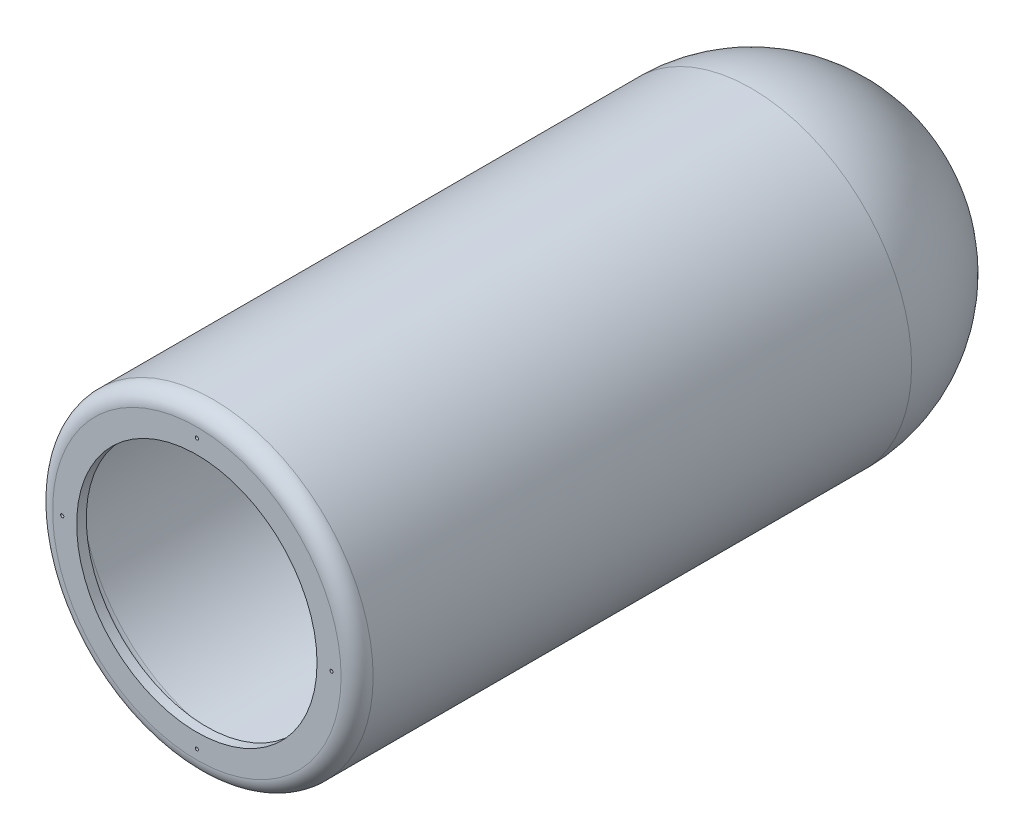
ISO-10303-21;
HEADER;
FILE_DESCRIPTION(('STEP AP214'),'2;1');
FILE_NAME('part.step','',(''),(''),'','','');
FILE_SCHEMA(('AUTOMOTIVE_DESIGN { 1 0 10303 214 1 1 1 1 }'));
ENDSEC;
DATA;
#1=APPLICATION_CONTEXT('core data for automotive mechanical design processes');
#2=APPLICATION_PROTOCOL_DEFINITION('international standard','automotive_design',2000,#1);
#3=PRODUCT_CONTEXT('',#1,'mechanical');
#4=PRODUCT('Part','Part','',(#3));
#5=PRODUCT_RELATED_PRODUCT_CATEGORY('part','',(#4));
#6=PRODUCT_DEFINITION_FORMATION('','',#4);
#7=PRODUCT_DEFINITION_CONTEXT('part definition',#1,'design');
#8=PRODUCT_DEFINITION('design','',#6,#7);
#9=PRODUCT_DEFINITION_SHAPE('','',#8);
#10=(LENGTH_UNIT() NAMED_UNIT(*) SI_UNIT(.MILLI.,.METRE.));
#11=(NAMED_UNIT(*) PLANE_ANGLE_UNIT() SI_UNIT($,.RADIAN.));
#12=(NAMED_UNIT(*) SI_UNIT($,.STERADIAN.) SOLID_ANGLE_UNIT());
#13=UNCERTAINTY_MEASURE_WITH_UNIT(LENGTH_MEASURE(1.E-05),#10,'distance_accuracy_value','');
#14=(GEOMETRIC_REPRESENTATION_CONTEXT(3) GLOBAL_UNCERTAINTY_ASSIGNED_CONTEXT((#13)) GLOBAL_UNIT_ASSIGNED_CONTEXT((#10,
#11,#12)) REPRESENTATION_CONTEXT('',''));
#15=CARTESIAN_POINT('',(0.,0.,0.));
#16=DIRECTION('',(0.,0.,1.));
#17=DIRECTION('',(1.,0.,0.));
#18=AXIS2_PLACEMENT_3D('',#15,#16,#17);
#19=CARTESIAN_POINT('',(0.,0.,0.));
#20=DIRECTION('',(0.,0.,1.));
#21=DIRECTION('',(1.,0.,0.));
#22=AXIS2_PLACEMENT_3D('',#19,#20,#21);
#23=PLANE('',#22);
#24=CARTESIAN_POINT('',(0.,0.,0.));
#25=DIRECTION('',(0.,0.,1.));
#26=DIRECTION('',(1.,0.,0.));
#27=AXIS2_PLACEMENT_3D('',#24,#25,#26);
#28=CIRCLE('',#27,39.);
#29=CARTESIAN_POINT('',(39.,0.,0.));
#30=VERTEX_POINT('',#29);
#31=EDGE_CURVE('E48',#30,#30,#28,.F.);
#32=ORIENTED_EDGE('',*,*,#31,.T.);
#33=EDGE_LOOP('',(#32));
#34=FACE_BOUND('',#33,.T.);
#35=CARTESIAN_POINT('',(0.,0.,0.));
#36=DIRECTION('',(0.,0.,1.));
#37=DIRECTION('',(1.,0.,0.));
#38=AXIS2_PLACEMENT_3D('',#35,#36,#37);
#39=CIRCLE('',#38,37.5);
#40=CARTESIAN_POINT('',(37.5,0.,0.));
#41=VERTEX_POINT('',#40);
#42=EDGE_CURVE('E57',#41,#41,#39,.T.);
#43=ORIENTED_EDGE('',*,*,#42,.T.);
#44=EDGE_LOOP('',(#43));
#45=FACE_BOUND('',#44,.T.);
#46=ADVANCED_FACE('F33',(#34,#45),#23,.F.);
#47=CARTESIAN_POINT('',(0.,0.,3.));
#48=DIRECTION('',(0.,0.,-1.));
#49=DIRECTION('',(-1.,0.,0.));
#50=AXIS2_PLACEMENT_3D('',#47,#48,#49);
#51=CYLINDRICAL_SURFACE('',#50,50.);
#52=CARTESIAN_POINT('',(0.,0.,-2.));
#53=DIRECTION('',(0.,0.,1.));
#54=DIRECTION('',(1.,0.,0.));
#55=AXIS2_PLACEMENT_3D('',#52,#53,#54);
#56=CIRCLE('',#55,50.);
#57=CARTESIAN_POINT('',(50.,0.,-2.));
#58=VERTEX_POINT('',#57);
#59=EDGE_CURVE('E10',#58,#58,#56,.F.);
#60=ORIENTED_EDGE('',*,*,#59,.T.);
#61=EDGE_LOOP('',(#60));
#62=FACE_BOUND('',#61,.T.);
#63=CARTESIAN_POINT('',(0.,0.,-170.));
#64=DIRECTION('',(0.,0.,-1.));
#65=DIRECTION('',(-1.,0.,0.));
#66=AXIS2_PLACEMENT_3D('',#63,#64,#65);
#67=CIRCLE('',#66,50.);
#68=CARTESIAN_POINT('',(-50.,0.,-170.));
#69=VERTEX_POINT('',#68);
#70=EDGE_CURVE('E63',#69,#69,#67,.T.);
#71=ORIENTED_EDGE('',*,*,#70,.F.);
#72=EDGE_LOOP('',(#71));
#73=FACE_BOUND('',#72,.T.);
#74=ADVANCED_FACE('F114',(#62,#73),#51,.T.);
#75=CARTESIAN_POINT('',(0.,0.,3.));
#76=DIRECTION('',(0.,0.,1.));
#77=DIRECTION('',(1.,0.,0.));
#78=AXIS2_PLACEMENT_3D('',#75,#76,#77);
#79=PLANE('',#78);
#80=CARTESIAN_POINT('',(0.,0.,3.));
#81=DIRECTION('',(0.,0.,1.));
#82=DIRECTION('',(1.,0.,0.));
#83=AXIS2_PLACEMENT_3D('',#80,#81,#82);
#84=CIRCLE('',#83,45.);
#85=CARTESIAN_POINT('',(45.,0.,3.));
#86=VERTEX_POINT('',#85);
#87=EDGE_CURVE('E40',#86,#86,#84,.T.);
#88=ORIENTED_EDGE('',*,*,#87,.T.);
#89=EDGE_LOOP('',(#88));
#90=FACE_BOUND('',#89,.T.);
#91=CARTESIAN_POINT('',(-42.,1.46642216231412E-13,3.));
#92=DIRECTION('',(0.,0.,1.));
#93=DIRECTION('',(1.,0.,0.));
#94=AXIS2_PLACEMENT_3D('',#91,#92,#93);
#95=CIRCLE('',#94,0.499999999999999);
#96=CARTESIAN_POINT('',(-41.5,1.46642216231412E-13,3.));
#97=VERTEX_POINT('',#96);
#98=EDGE_CURVE('E88',#97,#97,#95,.T.);
#99=ORIENTED_EDGE('',*,*,#98,.F.);
#100=EDGE_LOOP('',(#99));
#101=FACE_BOUND('',#100,.T.);
#102=CARTESIAN_POINT('',(2.93284432462823E-13,42.,3.));
#103=DIRECTION('',(0.,0.,1.));
#104=DIRECTION('',(1.,0.,0.));
#105=AXIS2_PLACEMENT_3D('',#102,#103,#104);
#106=CIRCLE('',#105,0.5);
#107=CARTESIAN_POINT('',(0.500000000000293,42.,3.));
#108=VERTEX_POINT('',#107);
#109=EDGE_CURVE('E82',#108,#108,#106,.T.);
#110=ORIENTED_EDGE('',*,*,#109,.F.);
#111=EDGE_LOOP('',(#110));
#112=FACE_BOUND('',#111,.T.);
#113=CARTESIAN_POINT('',(42.,-4.39926648694235E-13,3.));
#114=DIRECTION('',(0.,0.,1.));
#115=DIRECTION('',(1.,0.,0.));
#116=AXIS2_PLACEMENT_3D('',#113,#114,#115);
#117=CIRCLE('',#116,0.499999999999999);
#118=CARTESIAN_POINT('',(42.5,-4.39926648694235E-13,3.));
#119=VERTEX_POINT('',#118);
#120=EDGE_CURVE('E76',#119,#119,#117,.T.);
#121=ORIENTED_EDGE('',*,*,#120,.F.);
#122=EDGE_LOOP('',(#121));
#123=FACE_BOUND('',#122,.T.);
#124=CARTESIAN_POINT('',(0.,-42.,3.));
#125=DIRECTION('',(0.,0.,1.));
#126=DIRECTION('',(1.,0.,0.));
#127=AXIS2_PLACEMENT_3D('',#124,#125,#126);
#128=CIRCLE('',#127,0.5);
#129=CARTESIAN_POINT('',(0.5,-42.,3.));
#130=VERTEX_POINT('',#129);
#131=EDGE_CURVE('E70',#130,#130,#128,.T.);
#132=ORIENTED_EDGE('',*,*,#131,.F.);
#133=EDGE_LOOP('',(#132));
#134=FACE_BOUND('',#133,.T.);
#135=CARTESIAN_POINT('',(0.,0.,3.));
#136=DIRECTION('',(0.,0.,1.));
#137=DIRECTION('',(1.,0.,0.));
#138=AXIS2_PLACEMENT_3D('',#135,#136,#137);
#139=CIRCLE('',#138,37.5);
#140=CARTESIAN_POINT('',(37.5,0.,3.));
#141=VERTEX_POINT('',#140);
#142=EDGE_CURVE('E60',#141,#141,#139,.T.);
#143=ORIENTED_EDGE('',*,*,#142,.F.);
#144=EDGE_LOOP('',(#143));
#145=FACE_BOUND('',#144,.T.);
#146=ADVANCED_FACE('F120',(#90,#101,#112,#123,#134,#145),#79,.T.);
#147=CARTESIAN_POINT('',(0.,0.,-1.));
#148=DIRECTION('',(0.,0.,1.));
#149=DIRECTION('',(1.,0.,0.));
#150=AXIS2_PLACEMENT_3D('',#147,#148,#149);
#151=CYLINDRICAL_SURFACE('',#150,37.5);
#152=ORIENTED_EDGE('',*,*,#142,.T.);
#153=EDGE_LOOP('',(#152));
#154=FACE_BOUND('',#153,.T.);
#155=ORIENTED_EDGE('',*,*,#42,.F.);
#156=EDGE_LOOP('',(#155));
#157=FACE_BOUND('',#156,.T.);
#158=ADVANCED_FACE('F135',(#154,#157),#151,.F.);
#159=CARTESIAN_POINT('',(0.,0.,-170.));
#160=DIRECTION('',(0.,0.,1.));
#161=DIRECTION('',(1.,0.,0.));
#162=AXIS2_PLACEMENT_3D('',#159,#160,#161);
#163=CYLINDRICAL_SURFACE('',#162,47.);
#164=CARTESIAN_POINT('',(0.,0.,-8.00000000000001));
#165=DIRECTION('',(0.,0.,1.));
#166=DIRECTION('',(1.,0.,0.));
#167=AXIS2_PLACEMENT_3D('',#164,#165,#166);
#168=CIRCLE('',#167,47.);
#169=CARTESIAN_POINT('',(47.,0.,-8.00000000000001));
#170=VERTEX_POINT('',#169);
#171=EDGE_CURVE('E44',#170,#170,#168,.T.);
#172=ORIENTED_EDGE('',*,*,#171,.T.);
#173=EDGE_LOOP('',(#172));
#174=FACE_BOUND('',#173,.T.);
#175=CARTESIAN_POINT('',(0.,0.,-170.));
#176=DIRECTION('',(0.,0.,-1.));
#177=DIRECTION('',(-1.,0.,0.));
#178=AXIS2_PLACEMENT_3D('',#175,#176,#177);
#179=CIRCLE('',#178,47.);
#180=CARTESIAN_POINT('',(-47.,0.,-170.));
#181=VERTEX_POINT('',#180);
#182=EDGE_CURVE('E66',#181,#181,#179,.T.);
#183=ORIENTED_EDGE('',*,*,#182,.T.);
#184=EDGE_LOOP('',(#183));
#185=FACE_BOUND('',#184,.T.);
#186=ADVANCED_FACE('F127',(#174,#185),#163,.F.);
#187=CARTESIAN_POINT('',(0.,0.,-8.00000000000001));
#188=DIRECTION('',(0.,0.,1.));
#189=DIRECTION('',(1.,0.,0.));
#190=AXIS2_PLACEMENT_3D('',#187,#188,#189);
#191=TOROIDAL_SURFACE('',#190,39.,8.);
#192=ORIENTED_EDGE('',*,*,#171,.F.);
#193=EDGE_LOOP('',(#192));
#194=FACE_BOUND('',#193,.T.);
#195=ORIENTED_EDGE('',*,*,#31,.F.);
#196=EDGE_LOOP('',(#195));
#197=FACE_BOUND('',#196,.T.);
#198=ADVANCED_FACE('F125',(#194,#197),#191,.F.);
#199=CARTESIAN_POINT('',(0.,0.,-170.));
#200=DIRECTION('',(1.,0.,0.));
#201=DIRECTION('',(0.,-1.,0.));
#202=AXIS2_PLACEMENT_3D('',#199,#200,#201);
#203=SPHERICAL_SURFACE('',#202,47.);
#204=CARTESIAN_POINT('',(0.,0.,-170.));
#205=DIRECTION('',(0.,0.,1.));
#206=DIRECTION('',(1.,0.,0.));
#207=AXIS2_PLACEMENT_3D('',#204,#205,#206);
#208=SPHERICAL_SURFACE('',#207,47.);
#209=CARTESIAN_POINT('',(0.,0.,-216.976057731572));
#210=DIRECTION('',(0.,0.,1.));
#211=DIRECTION('',(1.,0.,0.));
#212=AXIS2_PLACEMENT_3D('',#209,#210,#211);
#213=CIRCLE('',#212,1.5);
#214=CARTESIAN_POINT('',(1.5,0.,-216.976057731572));
#215=VERTEX_POINT('',#214);
#216=EDGE_CURVE('E53',#215,#215,#213,.F.);
#217=ORIENTED_EDGE('',*,*,#216,.T.);
#218=EDGE_LOOP('',(#217));
#219=FACE_BOUND('',#218,.T.);
#220=ORIENTED_EDGE('',*,*,#182,.F.);
#221=EDGE_LOOP('',(#220));
#222=FACE_BOUND('',#221,.T.);
#223=ADVANCED_FACE('F96',(#219,#222),#208,.F.);
#224=CARTESIAN_POINT('',(0.,0.,-170.));
#225=DIRECTION('',(1.,0.,0.));
#226=DIRECTION('',(0.,-1.,0.));
#227=AXIS2_PLACEMENT_3D('',#224,#225,#226);
#228=SPHERICAL_SURFACE('',#227,50.);
#229=CARTESIAN_POINT('',(0.,0.,-170.));
#230=DIRECTION('',(0.,0.,1.));
#231=DIRECTION('',(1.,0.,0.));
#232=AXIS2_PLACEMENT_3D('',#229,#230,#231);
#233=SPHERICAL_SURFACE('',#232,50.);
#234=CARTESIAN_POINT('',(0.,0.,-219.977494935221));
#235=DIRECTION('',(0.,0.,1.));
#236=DIRECTION('',(1.,0.,0.));
#237=AXIS2_PLACEMENT_3D('',#234,#235,#236);
#238=CIRCLE('',#237,1.5);
#239=CARTESIAN_POINT('',(1.5,0.,-219.977494935221));
#240=VERTEX_POINT('',#239);
#241=EDGE_CURVE('E51',#240,#240,#238,.T.);
#242=ORIENTED_EDGE('',*,*,#241,.T.);
#243=EDGE_LOOP('',(#242));
#244=FACE_BOUND('',#243,.T.);
#245=ORIENTED_EDGE('',*,*,#70,.T.);
#246=EDGE_LOOP('',(#245));
#247=FACE_BOUND('',#246,.T.);
#248=ADVANCED_FACE('F133',(#244,#247),#233,.T.);
#249=CARTESIAN_POINT('',(0.,-42.,0.));
#250=DIRECTION('',(0.,0.,1.));
#251=DIRECTION('',(1.,0.,0.));
#252=AXIS2_PLACEMENT_3D('',#249,#250,#251);
#253=CYLINDRICAL_SURFACE('',#252,0.5);
#254=CARTESIAN_POINT('',(0.,-42.,0.));
#255=DIRECTION('',(0.,0.,1.));
#256=DIRECTION('',(1.,0.,0.));
#257=AXIS2_PLACEMENT_3D('',#254,#255,#256);
#258=CIRCLE('',#257,0.5);
#259=CARTESIAN_POINT('',(0.5,-42.,0.));
#260=VERTEX_POINT('',#259);
#261=EDGE_CURVE('E69',#260,#260,#258,.T.);
#262=ORIENTED_EDGE('',*,*,#261,.F.);
#263=EDGE_LOOP('',(#262));
#264=FACE_BOUND('',#263,.T.);
#265=ORIENTED_EDGE('',*,*,#131,.T.);
#266=EDGE_LOOP('',(#265));
#267=FACE_BOUND('',#266,.T.);
#268=ADVANCED_FACE('F150',(#264,#267),#253,.F.);
#269=CARTESIAN_POINT('',(0.,-42.,0.));
#270=DIRECTION('',(0.,0.,1.));
#271=DIRECTION('',(1.,0.,0.));
#272=AXIS2_PLACEMENT_3D('',#269,#270,#271);
#273=PLANE('',#272);
#274=ORIENTED_EDGE('',*,*,#261,.T.);
#275=EDGE_LOOP('',(#274));
#276=FACE_BOUND('',#275,.T.);
#277=ADVANCED_FACE('F154',(#276),#273,.T.);
#278=CARTESIAN_POINT('',(42.,-4.39926648694235E-13,0.));
#279=DIRECTION('',(0.,0.,1.));
#280=DIRECTION('',(1.,0.,0.));
#281=AXIS2_PLACEMENT_3D('',#278,#279,#280);
#282=CYLINDRICAL_SURFACE('',#281,0.499999999999999);
#283=CARTESIAN_POINT('',(42.,-4.39926648694235E-13,0.));
#284=DIRECTION('',(0.,0.,1.));
#285=DIRECTION('',(1.,0.,0.));
#286=AXIS2_PLACEMENT_3D('',#283,#284,#285);
#287=CIRCLE('',#286,0.499999999999999);
#288=CARTESIAN_POINT('',(42.5,-4.39926648694235E-13,0.));
#289=VERTEX_POINT('',#288);
#290=EDGE_CURVE('E79',#289,#289,#287,.T.);
#291=ORIENTED_EDGE('',*,*,#290,.F.);
#292=EDGE_LOOP('',(#291));
#293=FACE_BOUND('',#292,.T.);
#294=ORIENTED_EDGE('',*,*,#120,.T.);
#295=EDGE_LOOP('',(#294));
#296=FACE_BOUND('',#295,.T.);
#297=ADVANCED_FACE('F158',(#293,#296),#282,.F.);
#298=CARTESIAN_POINT('',(42.,-4.39926648694235E-13,0.));
#299=DIRECTION('',(0.,0.,1.));
#300=DIRECTION('',(1.,0.,0.));
#301=AXIS2_PLACEMENT_3D('',#298,#299,#300);
#302=PLANE('',#301);
#303=ORIENTED_EDGE('',*,*,#290,.T.);
#304=EDGE_LOOP('',(#303));
#305=FACE_BOUND('',#304,.T.);
#306=ADVANCED_FACE('F162',(#305),#302,.T.);
#307=CARTESIAN_POINT('',(2.93284432462823E-13,42.,0.));
#308=DIRECTION('',(0.,0.,1.));
#309=DIRECTION('',(1.,0.,0.));
#310=AXIS2_PLACEMENT_3D('',#307,#308,#309);
#311=CYLINDRICAL_SURFACE('',#310,0.5);
#312=CARTESIAN_POINT('',(2.93284432462823E-13,42.,0.));
#313=DIRECTION('',(0.,0.,1.));
#314=DIRECTION('',(1.,0.,0.));
#315=AXIS2_PLACEMENT_3D('',#312,#313,#314);
#316=CIRCLE('',#315,0.5);
#317=CARTESIAN_POINT('',(0.500000000000293,42.,0.));
#318=VERTEX_POINT('',#317);
#319=EDGE_CURVE('E85',#318,#318,#316,.T.);
#320=ORIENTED_EDGE('',*,*,#319,.F.);
#321=EDGE_LOOP('',(#320));
#322=FACE_BOUND('',#321,.T.);
#323=ORIENTED_EDGE('',*,*,#109,.T.);
#324=EDGE_LOOP('',(#323));
#325=FACE_BOUND('',#324,.T.);
#326=ADVANCED_FACE('F166',(#322,#325),#311,.F.);
#327=CARTESIAN_POINT('',(2.93284432462823E-13,42.,0.));
#328=DIRECTION('',(0.,0.,1.));
#329=DIRECTION('',(1.,0.,0.));
#330=AXIS2_PLACEMENT_3D('',#327,#328,#329);
#331=PLANE('',#330);
#332=ORIENTED_EDGE('',*,*,#319,.T.);
#333=EDGE_LOOP('',(#332));
#334=FACE_BOUND('',#333,.T.);
#335=ADVANCED_FACE('F170',(#334),#331,.T.);
#336=CARTESIAN_POINT('',(-42.,1.46642216231412E-13,0.));
#337=DIRECTION('',(0.,0.,1.));
#338=DIRECTION('',(1.,0.,0.));
#339=AXIS2_PLACEMENT_3D('',#336,#337,#338);
#340=CYLINDRICAL_SURFACE('',#339,0.499999999999999);
#341=CARTESIAN_POINT('',(-42.,1.46642216231412E-13,0.));
#342=DIRECTION('',(0.,0.,1.));
#343=DIRECTION('',(1.,0.,0.));
#344=AXIS2_PLACEMENT_3D('',#341,#342,#343);
#345=CIRCLE('',#344,0.499999999999999);
#346=CARTESIAN_POINT('',(-41.5,1.46642216231412E-13,0.));
#347=VERTEX_POINT('',#346);
#348=EDGE_CURVE('E73',#347,#347,#345,.T.);
#349=ORIENTED_EDGE('',*,*,#348,.F.);
#350=EDGE_LOOP('',(#349));
#351=FACE_BOUND('',#350,.T.);
#352=ORIENTED_EDGE('',*,*,#98,.T.);
#353=EDGE_LOOP('',(#352));
#354=FACE_BOUND('',#353,.T.);
#355=ADVANCED_FACE('F109',(#351,#354),#340,.F.);
#356=CARTESIAN_POINT('',(-42.,1.46642216231412E-13,0.));
#357=DIRECTION('',(0.,0.,1.));
#358=DIRECTION('',(1.,0.,0.));
#359=AXIS2_PLACEMENT_3D('',#356,#357,#358);
#360=PLANE('',#359);
#361=ORIENTED_EDGE('',*,*,#348,.T.);
#362=EDGE_LOOP('',(#361));
#363=FACE_BOUND('',#362,.T.);
#364=ADVANCED_FACE('F101',(#363),#360,.T.);
#365=CARTESIAN_POINT('',(0.,0.,-220.));
#366=DIRECTION('',(0.,0.,1.));
#367=DIRECTION('',(1.,0.,0.));
#368=AXIS2_PLACEMENT_3D('',#365,#366,#367);
#369=CYLINDRICAL_SURFACE('',#368,1.5);
#370=ORIENTED_EDGE('',*,*,#241,.F.);
#371=EDGE_LOOP('',(#370));
#372=FACE_BOUND('',#371,.T.);
#373=ORIENTED_EDGE('',*,*,#216,.F.);
#374=EDGE_LOOP('',(#373));
#375=FACE_BOUND('',#374,.T.);
#376=ADVANCED_FACE('F99',(#372,#375),#369,.F.);
#377=CARTESIAN_POINT('',(0.,0.,-2.));
#378=DIRECTION('',(0.,0.,1.));
#379=DIRECTION('',(1.,0.,0.));
#380=AXIS2_PLACEMENT_3D('',#377,#378,#379);
#381=TOROIDAL_SURFACE('',#380,45.,5.);
#382=ORIENTED_EDGE('',*,*,#59,.F.);
#383=EDGE_LOOP('',(#382));
#384=FACE_BOUND('',#383,.T.);
#385=ORIENTED_EDGE('',*,*,#87,.F.);
#386=EDGE_LOOP('',(#385));
#387=FACE_BOUND('',#386,.T.);
#388=ADVANCED_FACE('F35',(#384,#387),#381,.T.);
#389=CLOSED_SHELL('',(#46,#74,#146,#158,#186,#198,#223,#248,#268,#277,#297,#306,#326,#335,#355,
#364,#376,#388));
#390=MANIFOLD_SOLID_BREP('B2',#389);
#391=ADVANCED_BREP_SHAPE_REPRESENTATION('',(#18,#390),#14);
#392=SHAPE_DEFINITION_REPRESENTATION(#9,#391);
ENDSEC;
END-ISO-10303-21;
